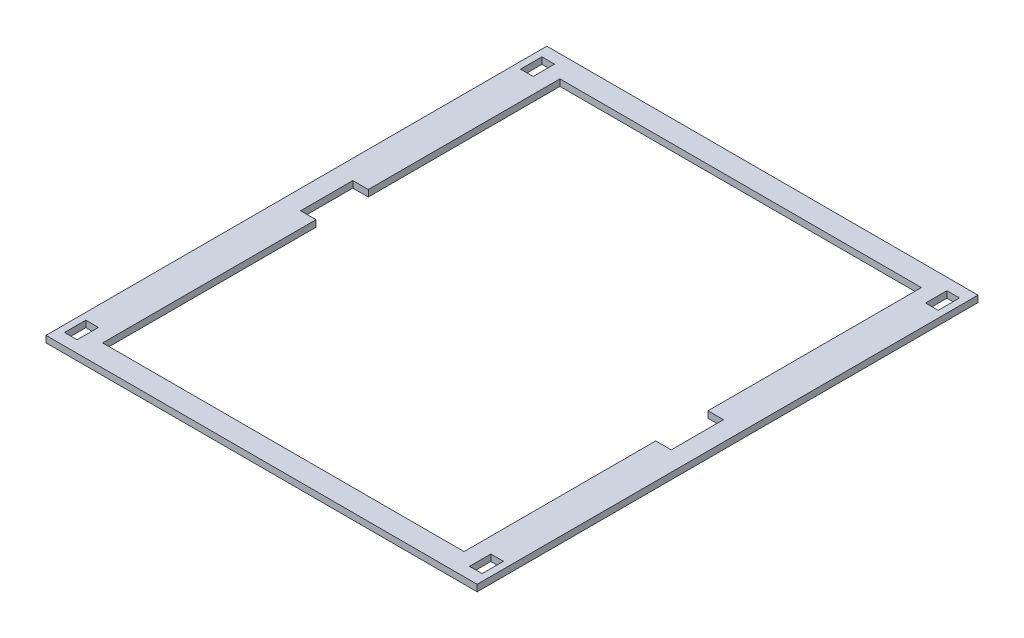
ISO-10303-21;
HEADER;
FILE_DESCRIPTION(('STEP AP214'),'2;1');
FILE_NAME('part.step','',(''),(''),'','','');
FILE_SCHEMA(('AUTOMOTIVE_DESIGN { 1 0 10303 214 1 1 1 1 }'));
ENDSEC;
DATA;
#1=APPLICATION_CONTEXT('core data for automotive mechanical design processes');
#2=APPLICATION_PROTOCOL_DEFINITION('international standard','automotive_design',2000,#1);
#3=PRODUCT_CONTEXT('',#1,'mechanical');
#4=PRODUCT('Part','Part','',(#3));
#5=PRODUCT_RELATED_PRODUCT_CATEGORY('part','',(#4));
#6=PRODUCT_DEFINITION_FORMATION('','',#4);
#7=PRODUCT_DEFINITION_CONTEXT('part definition',#1,'design');
#8=PRODUCT_DEFINITION('design','',#6,#7);
#9=PRODUCT_DEFINITION_SHAPE('','',#8);
#10=(LENGTH_UNIT() NAMED_UNIT(*) SI_UNIT(.MILLI.,.METRE.));
#11=(NAMED_UNIT(*) PLANE_ANGLE_UNIT() SI_UNIT($,.RADIAN.));
#12=(NAMED_UNIT(*) SI_UNIT($,.STERADIAN.) SOLID_ANGLE_UNIT());
#13=UNCERTAINTY_MEASURE_WITH_UNIT(LENGTH_MEASURE(1.E-05),#10,'distance_accuracy_value','');
#14=(GEOMETRIC_REPRESENTATION_CONTEXT(3) GLOBAL_UNCERTAINTY_ASSIGNED_CONTEXT((#13)) GLOBAL_UNIT_ASSIGNED_CONTEXT((#10,
#11,#12)) REPRESENTATION_CONTEXT('',''));
#15=CARTESIAN_POINT('',(0.,0.,0.));
#16=DIRECTION('',(0.,0.,1.));
#17=DIRECTION('',(1.,0.,0.));
#18=AXIS2_PLACEMENT_3D('',#15,#16,#17);
#19=CARTESIAN_POINT('',(0.,3.,0.));
#20=DIRECTION('',(0.,-1.,0.));
#21=DIRECTION('',(0.,0.,-1.));
#22=AXIS2_PLACEMENT_3D('',#19,#20,#21);
#23=PLANE('',#22);
#24=DIRECTION('',(-1.,0.,0.));
#25=VECTOR('',#24,1.);
#26=CARTESIAN_POINT('',(0.,3.,-15.1795233892321));
#27=LINE('',#26,#25);
#28=CARTESIAN_POINT('',(194.897407539515,3.,-15.1795233892321));
#29=VERTEX_POINT('',#28);
#30=CARTESIAN_POINT('',(189.097407539515,3.,-15.1795233892321));
#31=VERTEX_POINT('',#30);
#32=EDGE_CURVE('E645',#29,#31,#27,.T.);
#33=ORIENTED_EDGE('',*,*,#32,.F.);
#34=DIRECTION('',(0.,0.,-1.));
#35=VECTOR('',#34,1.);
#36=CARTESIAN_POINT('',(194.897407539515,3.,0.));
#37=LINE('',#36,#35);
#38=CARTESIAN_POINT('',(194.897407539515,3.,-5.37952338923212));
#39=VERTEX_POINT('',#38);
#40=EDGE_CURVE('E57',#39,#29,#37,.T.);
#41=ORIENTED_EDGE('',*,*,#40,.F.);
#42=DIRECTION('',(-1.,0.,0.));
#43=VECTOR('',#42,1.);
#44=CARTESIAN_POINT('',(0.,3.,-5.37952338923212));
#45=LINE('',#44,#43);
#46=CARTESIAN_POINT('',(189.097407539515,3.,-5.37952338923212));
#47=VERTEX_POINT('',#46);
#48=EDGE_CURVE('E632',#39,#47,#45,.T.);
#49=ORIENTED_EDGE('',*,*,#48,.T.);
#50=DIRECTION('',(0.,0.,-1.));
#51=VECTOR('',#50,1.);
#52=CARTESIAN_POINT('',(189.097407539515,3.,0.));
#53=LINE('',#52,#51);
#54=EDGE_CURVE('E657',#47,#31,#53,.T.);
#55=ORIENTED_EDGE('',*,*,#54,.T.);
#56=EDGE_LOOP('',(#33,#41,#49,#55));
#57=FACE_BOUND('',#56,.T.);
#58=DIRECTION('',(0.,0.,-1.));
#59=VECTOR('',#58,1.);
#60=CARTESIAN_POINT('',(3.10259246048478,3.,-5.37952338923212));
#61=LINE('',#60,#59);
#62=CARTESIAN_POINT('',(3.10259246048478,3.,-5.37952338923212));
#63=VERTEX_POINT('',#62);
#64=CARTESIAN_POINT('',(3.10259246048478,3.,-15.1795233892321));
#65=VERTEX_POINT('',#64);
#66=EDGE_CURVE('E281',#63,#65,#61,.T.);
#67=ORIENTED_EDGE('',*,*,#66,.T.);
#68=DIRECTION('',(1.,0.,0.));
#69=VECTOR('',#68,1.);
#70=CARTESIAN_POINT('',(3.10259246048478,3.,-15.1795233892321));
#71=LINE('',#70,#69);
#72=CARTESIAN_POINT('',(8.90259246048478,3.,-15.1795233892321));
#73=VERTEX_POINT('',#72);
#74=EDGE_CURVE('E277',#65,#73,#71,.T.);
#75=ORIENTED_EDGE('',*,*,#74,.T.);
#76=DIRECTION('',(0.,0.,-1.));
#77=VECTOR('',#76,1.);
#78=CARTESIAN_POINT('',(8.90259246048478,3.,-5.37952338923212));
#79=LINE('',#78,#77);
#80=CARTESIAN_POINT('',(8.90259246048478,3.,-5.37952338923212));
#81=VERTEX_POINT('',#80);
#82=EDGE_CURVE('E257',#81,#73,#79,.T.);
#83=ORIENTED_EDGE('',*,*,#82,.F.);
#84=DIRECTION('',(1.,0.,0.));
#85=VECTOR('',#84,1.);
#86=CARTESIAN_POINT('',(3.10259246048478,3.,-5.37952338923212));
#87=LINE('',#86,#85);
#88=EDGE_CURVE('E269',#63,#81,#87,.T.);
#89=ORIENTED_EDGE('',*,*,#88,.F.);
#90=EDGE_LOOP('',(#67,#75,#83,#89));
#91=FACE_BOUND('',#90,.T.);
#92=DIRECTION('',(0.,0.,1.));
#93=VECTOR('',#92,1.);
#94=CARTESIAN_POINT('',(189.097407539515,3.,0.));
#95=LINE('',#94,#93);
#96=CARTESIAN_POINT('',(189.097407539515,3.,-122.));
#97=VERTEX_POINT('',#96);
#98=CARTESIAN_POINT('',(189.097407539515,3.,-98.));
#99=VERTEX_POINT('',#98);
#100=EDGE_CURVE('E297',#97,#99,#95,.T.);
#101=ORIENTED_EDGE('',*,*,#100,.T.);
#102=DIRECTION('',(1.,0.,0.));
#103=VECTOR('',#102,1.);
#104=CARTESIAN_POINT('',(0.,3.,-98.));
#105=LINE('',#104,#103);
#106=CARTESIAN_POINT('',(182.,3.,-98.));
#107=VERTEX_POINT('',#106);
#108=EDGE_CURVE('E314',#107,#99,#105,.T.);
#109=ORIENTED_EDGE('',*,*,#108,.F.);
#110=DIRECTION('',(0.,0.,-1.));
#111=VECTOR('',#110,1.);
#112=CARTESIAN_POINT('',(182.,3.,-220.));
#113=LINE('',#112,#111);
#114=CARTESIAN_POINT('',(182.,3.,-10.));
#115=VERTEX_POINT('',#114);
#116=EDGE_CURVE('E459',#115,#107,#113,.T.);
#117=ORIENTED_EDGE('',*,*,#116,.F.);
#118=DIRECTION('',(1.,0.,0.));
#119=VECTOR('',#118,1.);
#120=CARTESIAN_POINT('',(16.,3.,-10.));
#121=LINE('',#120,#119);
#122=CARTESIAN_POINT('',(16.,3.,-10.));
#123=VERTEX_POINT('',#122);
#124=EDGE_CURVE('E421',#123,#115,#121,.T.);
#125=ORIENTED_EDGE('',*,*,#124,.F.);
#126=DIRECTION('',(0.,0.,1.));
#127=VECTOR('',#126,1.);
#128=CARTESIAN_POINT('',(16.,3.,-220.));
#129=LINE('',#128,#127);
#130=CARTESIAN_POINT('',(16.,3.,-108.));
#131=VERTEX_POINT('',#130);
#132=EDGE_CURVE('E422',#131,#123,#129,.T.);
#133=ORIENTED_EDGE('',*,*,#132,.F.);
#134=DIRECTION('',(-1.,0.,0.));
#135=VECTOR('',#134,1.);
#136=CARTESIAN_POINT('',(0.,3.,-108.));
#137=LINE('',#136,#135);
#138=CARTESIAN_POINT('',(8.90259246048478,3.,-108.));
#139=VERTEX_POINT('',#138);
#140=EDGE_CURVE('E393',#131,#139,#137,.T.);
#141=ORIENTED_EDGE('',*,*,#140,.T.);
#142=DIRECTION('',(0.,0.,1.));
#143=VECTOR('',#142,1.);
#144=CARTESIAN_POINT('',(8.90259246048478,3.,0.));
#145=LINE('',#144,#143);
#146=CARTESIAN_POINT('',(8.90259246048478,3.,-132.));
#147=VERTEX_POINT('',#146);
#148=EDGE_CURVE('E404',#147,#139,#145,.T.);
#149=ORIENTED_EDGE('',*,*,#148,.F.);
#150=DIRECTION('',(-1.,0.,0.));
#151=VECTOR('',#150,1.);
#152=CARTESIAN_POINT('',(0.,3.,-132.));
#153=LINE('',#152,#151);
#154=CARTESIAN_POINT('',(16.,3.,-132.));
#155=VERTEX_POINT('',#154);
#156=EDGE_CURVE('E399',#155,#147,#153,.T.);
#157=ORIENTED_EDGE('',*,*,#156,.F.);
#158=CARTESIAN_POINT('',(16.,3.,-220.));
#159=VERTEX_POINT('',#158);
#160=EDGE_CURVE('E415',#159,#155,#129,.T.);
#161=ORIENTED_EDGE('',*,*,#160,.F.);
#162=DIRECTION('',(-1.,0.,0.));
#163=VECTOR('',#162,1.);
#164=CARTESIAN_POINT('',(16.,3.,-220.));
#165=LINE('',#164,#163);
#166=CARTESIAN_POINT('',(182.,3.,-220.));
#167=VERTEX_POINT('',#166);
#168=EDGE_CURVE('E456',#167,#159,#165,.T.);
#169=ORIENTED_EDGE('',*,*,#168,.F.);
#170=CARTESIAN_POINT('',(182.,3.,-122.));
#171=VERTEX_POINT('',#170);
#172=EDGE_CURVE('E460',#171,#167,#113,.T.);
#173=ORIENTED_EDGE('',*,*,#172,.F.);
#174=DIRECTION('',(1.,0.,0.));
#175=VECTOR('',#174,1.);
#176=CARTESIAN_POINT('',(0.,3.,-122.));
#177=LINE('',#176,#175);
#178=EDGE_CURVE('E304',#171,#97,#177,.T.);
#179=ORIENTED_EDGE('',*,*,#178,.T.);
#180=EDGE_LOOP('',(#101,#109,#117,#125,#133,#141,#149,#157,#161,#169,#173,#179));
#181=FACE_BOUND('',#180,.T.);
#182=DIRECTION('',(0.,0.,1.));
#183=VECTOR('',#182,1.);
#184=CARTESIAN_POINT('',(0.,3.,0.));
#185=LINE('',#184,#183);
#186=CARTESIAN_POINT('',(0.,3.,-230.));
#187=VERTEX_POINT('',#186);
#188=CARTESIAN_POINT('',(0.,3.,0.));
#189=VERTEX_POINT('',#188);
#190=EDGE_CURVE('E464',#187,#189,#185,.T.);
#191=ORIENTED_EDGE('',*,*,#190,.T.);
#192=DIRECTION('',(1.,0.,0.));
#193=VECTOR('',#192,1.);
#194=CARTESIAN_POINT('',(0.,3.,0.));
#195=LINE('',#194,#193);
#196=CARTESIAN_POINT('',(198.,3.,0.));
#197=VERTEX_POINT('',#196);
#198=EDGE_CURVE('E467',#189,#197,#195,.T.);
#199=ORIENTED_EDGE('',*,*,#198,.T.);
#200=DIRECTION('',(0.,0.,-1.));
#201=VECTOR('',#200,1.);
#202=CARTESIAN_POINT('',(198.,3.,0.));
#203=LINE('',#202,#201);
#204=CARTESIAN_POINT('',(198.,3.,-230.));
#205=VERTEX_POINT('',#204);
#206=EDGE_CURVE('E471',#197,#205,#203,.T.);
#207=ORIENTED_EDGE('',*,*,#206,.T.);
#208=DIRECTION('',(-1.,0.,0.));
#209=VECTOR('',#208,1.);
#210=CARTESIAN_POINT('',(0.,3.,-230.));
#211=LINE('',#210,#209);
#212=EDGE_CURVE('E474',#205,#187,#211,.T.);
#213=ORIENTED_EDGE('',*,*,#212,.T.);
#214=EDGE_LOOP('',(#191,#199,#207,#213));
#215=FACE_BOUND('',#214,.T.);
#216=DIRECTION('',(1.,0.,0.));
#217=VECTOR('',#216,1.);
#218=CARTESIAN_POINT('',(3.10259246048478,3.,-214.820476610768));
#219=LINE('',#218,#217);
#220=CARTESIAN_POINT('',(3.10259246048478,3.,-214.820476610768));
#221=VERTEX_POINT('',#220);
#222=CARTESIAN_POINT('',(8.90259246048478,3.,-214.820476610768));
#223=VERTEX_POINT('',#222);
#224=EDGE_CURVE('E378',#221,#223,#219,.T.);
#225=ORIENTED_EDGE('',*,*,#224,.F.);
#226=DIRECTION('',(0.,0.,1.));
#227=VECTOR('',#226,1.);
#228=CARTESIAN_POINT('',(3.10259246048478,3.,-224.620476610768));
#229=LINE('',#228,#227);
#230=CARTESIAN_POINT('',(3.10259246048478,3.,-224.620476610768));
#231=VERTEX_POINT('',#230);
#232=EDGE_CURVE('E324',#231,#221,#229,.T.);
#233=ORIENTED_EDGE('',*,*,#232,.F.);
#234=DIRECTION('',(1.,0.,0.));
#235=VECTOR('',#234,1.);
#236=CARTESIAN_POINT('',(3.10259246048478,3.,-224.620476610768));
#237=LINE('',#236,#235);
#238=CARTESIAN_POINT('',(8.90259246048478,3.,-224.620476610768));
#239=VERTEX_POINT('',#238);
#240=EDGE_CURVE('E363',#231,#239,#237,.T.);
#241=ORIENTED_EDGE('',*,*,#240,.T.);
#242=DIRECTION('',(0.,0.,1.));
#243=VECTOR('',#242,1.);
#244=CARTESIAN_POINT('',(8.90259246048478,3.,-224.620476610768));
#245=LINE('',#244,#243);
#246=EDGE_CURVE('E367',#239,#223,#245,.T.);
#247=ORIENTED_EDGE('',*,*,#246,.T.);
#248=EDGE_LOOP('',(#225,#233,#241,#247));
#249=FACE_BOUND('',#248,.T.);
#250=DIRECTION('',(0.,0.,1.));
#251=VECTOR('',#250,1.);
#252=CARTESIAN_POINT('',(194.897407539515,3.,0.));
#253=LINE('',#252,#251);
#254=CARTESIAN_POINT('',(194.897407539515,3.,-224.620476610768));
#255=VERTEX_POINT('',#254);
#256=CARTESIAN_POINT('',(194.897407539515,3.,-214.820476610768));
#257=VERTEX_POINT('',#256);
#258=EDGE_CURVE('E65',#255,#257,#253,.T.);
#259=ORIENTED_EDGE('',*,*,#258,.T.);
#260=DIRECTION('',(-1.,0.,0.));
#261=VECTOR('',#260,1.);
#262=CARTESIAN_POINT('',(0.,3.,-214.820476610768));
#263=LINE('',#262,#261);
#264=CARTESIAN_POINT('',(189.097407539515,3.,-214.820476610768));
#265=VERTEX_POINT('',#264);
#266=EDGE_CURVE('E325',#257,#265,#263,.T.);
#267=ORIENTED_EDGE('',*,*,#266,.T.);
#268=DIRECTION('',(0.,0.,1.));
#269=VECTOR('',#268,1.);
#270=CARTESIAN_POINT('',(189.097407539515,3.,0.));
#271=LINE('',#270,#269);
#272=CARTESIAN_POINT('',(189.097407539515,3.,-224.620476610768));
#273=VERTEX_POINT('',#272);
#274=EDGE_CURVE('E330',#273,#265,#271,.T.);
#275=ORIENTED_EDGE('',*,*,#274,.F.);
#276=DIRECTION('',(-1.,0.,0.));
#277=VECTOR('',#276,1.);
#278=CARTESIAN_POINT('',(0.,3.,-224.620476610768));
#279=LINE('',#278,#277);
#280=EDGE_CURVE('E343',#255,#273,#279,.T.);
#281=ORIENTED_EDGE('',*,*,#280,.F.);
#282=EDGE_LOOP('',(#259,#267,#275,#281));
#283=FACE_BOUND('',#282,.T.);
#284=ADVANCED_FACE('F42',(#57,#91,#181,#215,#249,#283),#23,.F.);
#285=CARTESIAN_POINT('',(0.,0.,0.));
#286=DIRECTION('',(0.,-1.,0.));
#287=DIRECTION('',(0.,0.,-1.));
#288=AXIS2_PLACEMENT_3D('',#285,#286,#287);
#289=PLANE('',#288);
#290=DIRECTION('',(0.,0.,-1.));
#291=VECTOR('',#290,1.);
#292=CARTESIAN_POINT('',(194.897407539515,0.,0.));
#293=LINE('',#292,#291);
#294=CARTESIAN_POINT('',(194.897407539515,0.,-5.37952338923212));
#295=VERTEX_POINT('',#294);
#296=CARTESIAN_POINT('',(194.897407539515,0.,-15.1795233892321));
#297=VERTEX_POINT('',#296);
#298=EDGE_CURVE('E629',#295,#297,#293,.T.);
#299=ORIENTED_EDGE('',*,*,#298,.T.);
#300=DIRECTION('',(-1.,0.,0.));
#301=VECTOR('',#300,1.);
#302=CARTESIAN_POINT('',(0.,0.,-15.1795233892321));
#303=LINE('',#302,#301);
#304=CARTESIAN_POINT('',(189.097407539515,0.,-15.1795233892321));
#305=VERTEX_POINT('',#304);
#306=EDGE_CURVE('E633',#297,#305,#303,.T.);
#307=ORIENTED_EDGE('',*,*,#306,.T.);
#308=DIRECTION('',(0.,0.,-1.));
#309=VECTOR('',#308,1.);
#310=CARTESIAN_POINT('',(189.097407539515,0.,0.));
#311=LINE('',#310,#309);
#312=CARTESIAN_POINT('',(189.097407539515,0.,-5.37952338923212));
#313=VERTEX_POINT('',#312);
#314=EDGE_CURVE('E636',#313,#305,#311,.T.);
#315=ORIENTED_EDGE('',*,*,#314,.F.);
#316=DIRECTION('',(-1.,0.,0.));
#317=VECTOR('',#316,1.);
#318=CARTESIAN_POINT('',(0.,0.,-5.37952338923212));
#319=LINE('',#318,#317);
#320=EDGE_CURVE('E639',#295,#313,#319,.T.);
#321=ORIENTED_EDGE('',*,*,#320,.F.);
#322=EDGE_LOOP('',(#299,#307,#315,#321));
#323=FACE_BOUND('',#322,.T.);
#324=DIRECTION('',(1.,0.,0.));
#325=VECTOR('',#324,1.);
#326=CARTESIAN_POINT('',(0.,0.,-98.));
#327=LINE('',#326,#325);
#328=CARTESIAN_POINT('',(182.,0.,-98.));
#329=VERTEX_POINT('',#328);
#330=CARTESIAN_POINT('',(189.097407539515,0.,-98.));
#331=VERTEX_POINT('',#330);
#332=EDGE_CURVE('E306',#329,#331,#327,.T.);
#333=ORIENTED_EDGE('',*,*,#332,.T.);
#334=DIRECTION('',(0.,0.,1.));
#335=VECTOR('',#334,1.);
#336=CARTESIAN_POINT('',(189.097407539515,0.,0.));
#337=LINE('',#336,#335);
#338=CARTESIAN_POINT('',(189.097407539515,0.,-122.));
#339=VERTEX_POINT('',#338);
#340=EDGE_CURVE('E312',#339,#331,#337,.T.);
#341=ORIENTED_EDGE('',*,*,#340,.F.);
#342=DIRECTION('',(1.,0.,0.));
#343=VECTOR('',#342,1.);
#344=CARTESIAN_POINT('',(0.,0.,-122.));
#345=LINE('',#344,#343);
#346=CARTESIAN_POINT('',(182.,0.,-122.));
#347=VERTEX_POINT('',#346);
#348=EDGE_CURVE('E309',#347,#339,#345,.T.);
#349=ORIENTED_EDGE('',*,*,#348,.F.);
#350=DIRECTION('',(0.,0.,-1.));
#351=VECTOR('',#350,1.);
#352=CARTESIAN_POINT('',(182.,0.,-220.));
#353=LINE('',#352,#351);
#354=CARTESIAN_POINT('',(182.,0.,-220.));
#355=VERTEX_POINT('',#354);
#356=EDGE_CURVE('E595',#347,#355,#353,.T.);
#357=ORIENTED_EDGE('',*,*,#356,.T.);
#358=DIRECTION('',(-1.,0.,0.));
#359=VECTOR('',#358,1.);
#360=CARTESIAN_POINT('',(16.,0.,-220.));
#361=LINE('',#360,#359);
#362=CARTESIAN_POINT('',(16.,0.,-220.));
#363=VERTEX_POINT('',#362);
#364=EDGE_CURVE('E589',#355,#363,#361,.T.);
#365=ORIENTED_EDGE('',*,*,#364,.T.);
#366=DIRECTION('',(0.,0.,1.));
#367=VECTOR('',#366,1.);
#368=CARTESIAN_POINT('',(16.,0.,-220.));
#369=LINE('',#368,#367);
#370=CARTESIAN_POINT('',(16.,0.,-132.));
#371=VERTEX_POINT('',#370);
#372=EDGE_CURVE('E599',#363,#371,#369,.T.);
#373=ORIENTED_EDGE('',*,*,#372,.T.);
#374=DIRECTION('',(-1.,0.,0.));
#375=VECTOR('',#374,1.);
#376=CARTESIAN_POINT('',(0.,0.,-132.));
#377=LINE('',#376,#375);
#378=CARTESIAN_POINT('',(8.90259246048478,0.,-132.));
#379=VERTEX_POINT('',#378);
#380=EDGE_CURVE('E389',#371,#379,#377,.T.);
#381=ORIENTED_EDGE('',*,*,#380,.T.);
#382=DIRECTION('',(0.,0.,1.));
#383=VECTOR('',#382,1.);
#384=CARTESIAN_POINT('',(8.90259246048478,0.,0.));
#385=LINE('',#384,#383);
#386=CARTESIAN_POINT('',(8.90259246048478,0.,-108.));
#387=VERTEX_POINT('',#386);
#388=EDGE_CURVE('E392',#379,#387,#385,.T.);
#389=ORIENTED_EDGE('',*,*,#388,.T.);
#390=DIRECTION('',(-1.,0.,0.));
#391=VECTOR('',#390,1.);
#392=CARTESIAN_POINT('',(0.,0.,-108.));
#393=LINE('',#392,#391);
#394=CARTESIAN_POINT('',(16.,0.,-108.));
#395=VERTEX_POINT('',#394);
#396=EDGE_CURVE('E396',#395,#387,#393,.T.);
#397=ORIENTED_EDGE('',*,*,#396,.F.);
#398=CARTESIAN_POINT('',(16.,0.,-10.));
#399=VERTEX_POINT('',#398);
#400=EDGE_CURVE('E435',#395,#399,#369,.T.);
#401=ORIENTED_EDGE('',*,*,#400,.T.);
#402=DIRECTION('',(1.,0.,0.));
#403=VECTOR('',#402,1.);
#404=CARTESIAN_POINT('',(16.,0.,-10.));
#405=LINE('',#404,#403);
#406=CARTESIAN_POINT('',(182.,0.,-10.));
#407=VERTEX_POINT('',#406);
#408=EDGE_CURVE('E596',#399,#407,#405,.T.);
#409=ORIENTED_EDGE('',*,*,#408,.T.);
#410=EDGE_CURVE('E592',#407,#329,#353,.T.);
#411=ORIENTED_EDGE('',*,*,#410,.T.);
#412=EDGE_LOOP('',(#333,#341,#349,#357,#365,#373,#381,#389,#397,#401,#409,#411));
#413=FACE_BOUND('',#412,.T.);
#414=DIRECTION('',(0.,0.,1.));
#415=VECTOR('',#414,1.);
#416=CARTESIAN_POINT('',(3.10259246048478,0.,-224.620476610768));
#417=LINE('',#416,#415);
#418=CARTESIAN_POINT('',(3.10259246048478,0.,-224.620476610768));
#419=VERTEX_POINT('',#418);
#420=CARTESIAN_POINT('',(3.10259246048478,0.,-214.820476610768));
#421=VERTEX_POINT('',#420);
#422=EDGE_CURVE('E368',#419,#421,#417,.T.);
#423=ORIENTED_EDGE('',*,*,#422,.T.);
#424=DIRECTION('',(1.,0.,0.));
#425=VECTOR('',#424,1.);
#426=CARTESIAN_POINT('',(3.10259246048478,0.,-214.820476610768));
#427=LINE('',#426,#425);
#428=CARTESIAN_POINT('',(8.90259246048478,0.,-214.820476610768));
#429=VERTEX_POINT('',#428);
#430=EDGE_CURVE('E384',#421,#429,#427,.T.);
#431=ORIENTED_EDGE('',*,*,#430,.T.);
#432=DIRECTION('',(0.,0.,1.));
#433=VECTOR('',#432,1.);
#434=CARTESIAN_POINT('',(8.90259246048478,0.,-224.620476610768));
#435=LINE('',#434,#433);
#436=CARTESIAN_POINT('',(8.90259246048478,0.,-224.620476610768));
#437=VERTEX_POINT('',#436);
#438=EDGE_CURVE('E381',#437,#429,#435,.T.);
#439=ORIENTED_EDGE('',*,*,#438,.F.);
#440=DIRECTION('',(1.,0.,0.));
#441=VECTOR('',#440,1.);
#442=CARTESIAN_POINT('',(3.10259246048478,0.,-224.620476610768));
#443=LINE('',#442,#441);
#444=EDGE_CURVE('E356',#419,#437,#443,.T.);
#445=ORIENTED_EDGE('',*,*,#444,.F.);
#446=EDGE_LOOP('',(#423,#431,#439,#445));
#447=FACE_BOUND('',#446,.T.);
#448=DIRECTION('',(0.,0.,1.));
#449=VECTOR('',#448,1.);
#450=CARTESIAN_POINT('',(0.,0.,0.));
#451=LINE('',#450,#449);
#452=CARTESIAN_POINT('',(0.,0.,-230.));
#453=VERTEX_POINT('',#452);
#454=CARTESIAN_POINT('',(0.,0.,0.));
#455=VERTEX_POINT('',#454);
#456=EDGE_CURVE('E553',#453,#455,#451,.T.);
#457=ORIENTED_EDGE('',*,*,#456,.F.);
#458=DIRECTION('',(-1.,0.,0.));
#459=VECTOR('',#458,1.);
#460=CARTESIAN_POINT('',(0.,0.,-230.));
#461=LINE('',#460,#459);
#462=CARTESIAN_POINT('',(198.,0.,-230.));
#463=VERTEX_POINT('',#462);
#464=EDGE_CURVE('E468',#463,#453,#461,.T.);
#465=ORIENTED_EDGE('',*,*,#464,.F.);
#466=DIRECTION('',(0.,0.,-1.));
#467=VECTOR('',#466,1.);
#468=CARTESIAN_POINT('',(198.,0.,0.));
#469=LINE('',#468,#467);
#470=CARTESIAN_POINT('',(198.,0.,0.));
#471=VERTEX_POINT('',#470);
#472=EDGE_CURVE('E552',#471,#463,#469,.T.);
#473=ORIENTED_EDGE('',*,*,#472,.F.);
#474=DIRECTION('',(1.,0.,0.));
#475=VECTOR('',#474,1.);
#476=CARTESIAN_POINT('',(0.,0.,0.));
#477=LINE('',#476,#475);
#478=EDGE_CURVE('E544',#455,#471,#477,.T.);
#479=ORIENTED_EDGE('',*,*,#478,.F.);
#480=EDGE_LOOP('',(#457,#465,#473,#479));
#481=FACE_BOUND('',#480,.T.);
#482=DIRECTION('',(1.,0.,0.));
#483=VECTOR('',#482,1.);
#484=CARTESIAN_POINT('',(3.10259246048478,0.,-15.1795233892321));
#485=LINE('',#484,#483);
#486=CARTESIAN_POINT('',(3.10259246048478,0.,-15.1795233892321));
#487=VERTEX_POINT('',#486);
#488=CARTESIAN_POINT('',(8.90259246048478,0.,-15.1795233892321));
#489=VERTEX_POINT('',#488);
#490=EDGE_CURVE('E684',#487,#489,#485,.T.);
#491=ORIENTED_EDGE('',*,*,#490,.F.);
#492=DIRECTION('',(0.,0.,-1.));
#493=VECTOR('',#492,1.);
#494=CARTESIAN_POINT('',(3.10259246048478,0.,-5.37952338923212));
#495=LINE('',#494,#493);
#496=CARTESIAN_POINT('',(3.10259246048478,0.,-5.37952338923212));
#497=VERTEX_POINT('',#496);
#498=EDGE_CURVE('E274',#497,#487,#495,.T.);
#499=ORIENTED_EDGE('',*,*,#498,.F.);
#500=DIRECTION('',(1.,0.,0.));
#501=VECTOR('',#500,1.);
#502=CARTESIAN_POINT('',(3.10259246048478,0.,-5.37952338923212));
#503=LINE('',#502,#501);
#504=CARTESIAN_POINT('',(8.90259246048478,0.,-5.37952338923212));
#505=VERTEX_POINT('',#504);
#506=EDGE_CURVE('E687',#497,#505,#503,.T.);
#507=ORIENTED_EDGE('',*,*,#506,.T.);
#508=DIRECTION('',(0.,0.,-1.));
#509=VECTOR('',#508,1.);
#510=CARTESIAN_POINT('',(8.90259246048478,0.,-5.37952338923212));
#511=LINE('',#510,#509);
#512=EDGE_CURVE('E260',#505,#489,#511,.T.);
#513=ORIENTED_EDGE('',*,*,#512,.T.);
#514=EDGE_LOOP('',(#491,#499,#507,#513));
#515=FACE_BOUND('',#514,.T.);
#516=DIRECTION('',(-1.,0.,0.));
#517=VECTOR('',#516,1.);
#518=CARTESIAN_POINT('',(0.,0.,-214.820476610768));
#519=LINE('',#518,#517);
#520=CARTESIAN_POINT('',(194.897407539515,0.,-214.820476610768));
#521=VERTEX_POINT('',#520);
#522=CARTESIAN_POINT('',(189.097407539515,0.,-214.820476610768));
#523=VERTEX_POINT('',#522);
#524=EDGE_CURVE('E317',#521,#523,#519,.T.);
#525=ORIENTED_EDGE('',*,*,#524,.F.);
#526=DIRECTION('',(0.,0.,1.));
#527=VECTOR('',#526,1.);
#528=CARTESIAN_POINT('',(194.897407539515,0.,0.));
#529=LINE('',#528,#527);
#530=CARTESIAN_POINT('',(194.897407539515,0.,-224.620476610768));
#531=VERTEX_POINT('',#530);
#532=EDGE_CURVE('E331',#531,#521,#529,.T.);
#533=ORIENTED_EDGE('',*,*,#532,.F.);
#534=DIRECTION('',(-1.,0.,0.));
#535=VECTOR('',#534,1.);
#536=CARTESIAN_POINT('',(0.,0.,-224.620476610768));
#537=LINE('',#536,#535);
#538=CARTESIAN_POINT('',(189.097407539515,0.,-224.620476610768));
#539=VERTEX_POINT('',#538);
#540=EDGE_CURVE('E349',#531,#539,#537,.T.);
#541=ORIENTED_EDGE('',*,*,#540,.T.);
#542=DIRECTION('',(0.,0.,1.));
#543=VECTOR('',#542,1.);
#544=CARTESIAN_POINT('',(189.097407539515,0.,0.));
#545=LINE('',#544,#543);
#546=EDGE_CURVE('E346',#539,#523,#545,.T.);
#547=ORIENTED_EDGE('',*,*,#546,.T.);
#548=EDGE_LOOP('',(#525,#533,#541,#547));
#549=FACE_BOUND('',#548,.T.);
#550=ADVANCED_FACE('F498',(#323,#413,#447,#481,#515,#549),#289,.T.);
#551=CARTESIAN_POINT('',(16.,3.,-220.));
#552=DIRECTION('',(1.,0.,0.));
#553=DIRECTION('',(0.,0.,-1.));
#554=AXIS2_PLACEMENT_3D('',#551,#552,#553);
#555=PLANE('',#554);
#556=ORIENTED_EDGE('',*,*,#400,.F.);
#557=DIRECTION('',(0.,1.,0.));
#558=VECTOR('',#557,1.);
#559=CARTESIAN_POINT('',(16.,0.,-108.));
#560=LINE('',#559,#558);
#561=EDGE_CURVE('E436',#395,#131,#560,.T.);
#562=ORIENTED_EDGE('',*,*,#561,.T.);
#563=ORIENTED_EDGE('',*,*,#132,.T.);
#564=DIRECTION('',(0.,-1.,0.));
#565=VECTOR('',#564,1.);
#566=CARTESIAN_POINT('',(16.,3.,-10.));
#567=LINE('',#566,#565);
#568=EDGE_CURVE('E570',#123,#399,#567,.T.);
#569=ORIENTED_EDGE('',*,*,#568,.T.);
#570=EDGE_LOOP('',(#556,#562,#563,#569));
#571=FACE_BOUND('',#570,.T.);
#572=ADVANCED_FACE('F520',(#571),#555,.T.);
#573=CARTESIAN_POINT('',(182.,3.,-220.));
#574=DIRECTION('',(-1.,0.,0.));
#575=DIRECTION('',(0.,0.,1.));
#576=AXIS2_PLACEMENT_3D('',#573,#574,#575);
#577=PLANE('',#576);
#578=ORIENTED_EDGE('',*,*,#356,.F.);
#579=DIRECTION('',(0.,1.,0.));
#580=VECTOR('',#579,1.);
#581=CARTESIAN_POINT('',(182.,0.,-122.));
#582=LINE('',#581,#580);
#583=EDGE_CURVE('E625',#347,#171,#582,.T.);
#584=ORIENTED_EDGE('',*,*,#583,.T.);
#585=ORIENTED_EDGE('',*,*,#172,.T.);
#586=DIRECTION('',(0.,-1.,0.));
#587=VECTOR('',#586,1.);
#588=CARTESIAN_POINT('',(182.,3.,-220.));
#589=LINE('',#588,#587);
#590=EDGE_CURVE('E584',#167,#355,#589,.T.);
#591=ORIENTED_EDGE('',*,*,#590,.T.);
#592=EDGE_LOOP('',(#578,#584,#585,#591));
#593=FACE_BOUND('',#592,.T.);
#594=ADVANCED_FACE('F541',(#593),#577,.T.);
#595=CARTESIAN_POINT('',(0.,3.,0.));
#596=DIRECTION('',(1.,0.,0.));
#597=DIRECTION('',(0.,0.,-1.));
#598=AXIS2_PLACEMENT_3D('',#595,#596,#597);
#599=PLANE('',#598);
#600=ORIENTED_EDGE('',*,*,#456,.T.);
#601=DIRECTION('',(0.,-1.,0.));
#602=VECTOR('',#601,1.);
#603=CARTESIAN_POINT('',(0.,3.,0.));
#604=LINE('',#603,#602);
#605=EDGE_CURVE('E12',#189,#455,#604,.T.);
#606=ORIENTED_EDGE('',*,*,#605,.F.);
#607=ORIENTED_EDGE('',*,*,#190,.F.);
#608=DIRECTION('',(0.,-1.,0.));
#609=VECTOR('',#608,1.);
#610=CARTESIAN_POINT('',(0.,3.,-230.));
#611=LINE('',#610,#609);
#612=EDGE_CURVE('E477',#187,#453,#611,.T.);
#613=ORIENTED_EDGE('',*,*,#612,.T.);
#614=EDGE_LOOP('',(#600,#606,#607,#613));
#615=FACE_BOUND('',#614,.T.);
#616=ADVANCED_FACE('F44',(#615),#599,.F.);
#617=CARTESIAN_POINT('',(0.,3.,0.));
#618=DIRECTION('',(0.,0.,-1.));
#619=DIRECTION('',(-1.,0.,0.));
#620=AXIS2_PLACEMENT_3D('',#617,#618,#619);
#621=PLANE('',#620);
#622=ORIENTED_EDGE('',*,*,#478,.T.);
#623=DIRECTION('',(0.,-1.,0.));
#624=VECTOR('',#623,1.);
#625=CARTESIAN_POINT('',(198.,3.,0.));
#626=LINE('',#625,#624);
#627=EDGE_CURVE('E50',#197,#471,#626,.T.);
#628=ORIENTED_EDGE('',*,*,#627,.F.);
#629=ORIENTED_EDGE('',*,*,#198,.F.);
#630=ORIENTED_EDGE('',*,*,#605,.T.);
#631=EDGE_LOOP('',(#622,#628,#629,#630));
#632=FACE_BOUND('',#631,.T.);
#633=ADVANCED_FACE('F534',(#632),#621,.F.);
#634=CARTESIAN_POINT('',(198.,3.,0.));
#635=DIRECTION('',(-1.,0.,0.));
#636=DIRECTION('',(0.,0.,1.));
#637=AXIS2_PLACEMENT_3D('',#634,#635,#636);
#638=PLANE('',#637);
#639=ORIENTED_EDGE('',*,*,#472,.T.);
#640=DIRECTION('',(0.,-1.,0.));
#641=VECTOR('',#640,1.);
#642=CARTESIAN_POINT('',(198.,3.,-230.));
#643=LINE('',#642,#641);
#644=EDGE_CURVE('E557',#205,#463,#643,.T.);
#645=ORIENTED_EDGE('',*,*,#644,.F.);
#646=ORIENTED_EDGE('',*,*,#206,.F.);
#647=ORIENTED_EDGE('',*,*,#627,.T.);
#648=EDGE_LOOP('',(#639,#645,#646,#647));
#649=FACE_BOUND('',#648,.T.);
#650=ADVANCED_FACE('F531',(#649),#638,.F.);
#651=CARTESIAN_POINT('',(0.,3.,-230.));
#652=DIRECTION('',(0.,0.,1.));
#653=DIRECTION('',(1.,0.,0.));
#654=AXIS2_PLACEMENT_3D('',#651,#652,#653);
#655=PLANE('',#654);
#656=ORIENTED_EDGE('',*,*,#464,.T.);
#657=ORIENTED_EDGE('',*,*,#612,.F.);
#658=ORIENTED_EDGE('',*,*,#212,.F.);
#659=ORIENTED_EDGE('',*,*,#644,.T.);
#660=EDGE_LOOP('',(#656,#657,#658,#659));
#661=FACE_BOUND('',#660,.T.);
#662=ADVANCED_FACE('F528',(#661),#655,.F.);
#663=DIRECTION('',(0.,1.,0.));
#664=VECTOR('',#663,1.);
#665=CARTESIAN_POINT('',(16.,0.,-132.));
#666=LINE('',#665,#664);
#667=EDGE_CURVE('E433',#371,#155,#666,.T.);
#668=ORIENTED_EDGE('',*,*,#667,.F.);
#669=ORIENTED_EDGE('',*,*,#372,.F.);
#670=DIRECTION('',(0.,-1.,0.));
#671=VECTOR('',#670,1.);
#672=CARTESIAN_POINT('',(16.,3.,-220.));
#673=LINE('',#672,#671);
#674=EDGE_CURVE('E458',#159,#363,#673,.T.);
#675=ORIENTED_EDGE('',*,*,#674,.F.);
#676=ORIENTED_EDGE('',*,*,#160,.T.);
#677=EDGE_LOOP('',(#668,#669,#675,#676));
#678=FACE_BOUND('',#677,.T.);
#679=ADVANCED_FACE('F525',(#678),#555,.T.);
#680=CARTESIAN_POINT('',(16.,3.,-10.));
#681=DIRECTION('',(0.,0.,-1.));
#682=DIRECTION('',(-1.,0.,0.));
#683=AXIS2_PLACEMENT_3D('',#680,#681,#682);
#684=PLANE('',#683);
#685=ORIENTED_EDGE('',*,*,#408,.F.);
#686=ORIENTED_EDGE('',*,*,#568,.F.);
#687=ORIENTED_EDGE('',*,*,#124,.T.);
#688=DIRECTION('',(0.,-1.,0.));
#689=VECTOR('',#688,1.);
#690=CARTESIAN_POINT('',(182.,3.,-10.));
#691=LINE('',#690,#689);
#692=EDGE_CURVE('E572',#115,#407,#691,.T.);
#693=ORIENTED_EDGE('',*,*,#692,.T.);
#694=EDGE_LOOP('',(#685,#686,#687,#693));
#695=FACE_BOUND('',#694,.T.);
#696=ADVANCED_FACE('F960',(#695),#684,.T.);
#697=DIRECTION('',(0.,1.,0.));
#698=VECTOR('',#697,1.);
#699=CARTESIAN_POINT('',(182.,0.,-98.));
#700=LINE('',#699,#698);
#701=EDGE_CURVE('E614',#329,#107,#700,.T.);
#702=ORIENTED_EDGE('',*,*,#701,.F.);
#703=ORIENTED_EDGE('',*,*,#410,.F.);
#704=ORIENTED_EDGE('',*,*,#692,.F.);
#705=ORIENTED_EDGE('',*,*,#116,.T.);
#706=EDGE_LOOP('',(#702,#703,#704,#705));
#707=FACE_BOUND('',#706,.T.);
#708=ADVANCED_FACE('F612',(#707),#577,.T.);
#709=CARTESIAN_POINT('',(16.,3.,-220.));
#710=DIRECTION('',(0.,0.,1.));
#711=DIRECTION('',(1.,0.,0.));
#712=AXIS2_PLACEMENT_3D('',#709,#710,#711);
#713=PLANE('',#712);
#714=ORIENTED_EDGE('',*,*,#364,.F.);
#715=ORIENTED_EDGE('',*,*,#590,.F.);
#716=ORIENTED_EDGE('',*,*,#168,.T.);
#717=ORIENTED_EDGE('',*,*,#674,.T.);
#718=EDGE_LOOP('',(#714,#715,#716,#717));
#719=FACE_BOUND('',#718,.T.);
#720=ADVANCED_FACE('F725',(#719),#713,.T.);
#721=CARTESIAN_POINT('',(189.097407539515,0.,0.));
#722=DIRECTION('',(-1.,0.,0.));
#723=DIRECTION('',(0.,0.,1.));
#724=AXIS2_PLACEMENT_3D('',#721,#722,#723);
#725=PLANE('',#724);
#726=ORIENTED_EDGE('',*,*,#100,.F.);
#727=DIRECTION('',(0.,1.,0.));
#728=VECTOR('',#727,1.);
#729=CARTESIAN_POINT('',(189.097407539515,0.,-122.));
#730=LINE('',#729,#728);
#731=EDGE_CURVE('E310',#339,#97,#730,.T.);
#732=ORIENTED_EDGE('',*,*,#731,.F.);
#733=ORIENTED_EDGE('',*,*,#340,.T.);
#734=DIRECTION('',(0.,1.,0.));
#735=VECTOR('',#734,1.);
#736=CARTESIAN_POINT('',(189.097407539515,0.,-98.));
#737=LINE('',#736,#735);
#738=EDGE_CURVE('E342',#331,#99,#737,.T.);
#739=ORIENTED_EDGE('',*,*,#738,.T.);
#740=EDGE_LOOP('',(#726,#732,#733,#739));
#741=FACE_BOUND('',#740,.T.);
#742=ADVANCED_FACE('F721',(#741),#725,.T.);
#743=CARTESIAN_POINT('',(0.,0.,-98.));
#744=DIRECTION('',(0.,0.,1.));
#745=DIRECTION('',(1.,0.,0.));
#746=AXIS2_PLACEMENT_3D('',#743,#744,#745);
#747=PLANE('',#746);
#748=ORIENTED_EDGE('',*,*,#108,.T.);
#749=ORIENTED_EDGE('',*,*,#738,.F.);
#750=ORIENTED_EDGE('',*,*,#332,.F.);
#751=ORIENTED_EDGE('',*,*,#701,.T.);
#752=EDGE_LOOP('',(#748,#749,#750,#751));
#753=FACE_BOUND('',#752,.T.);
#754=ADVANCED_FACE('F724',(#753),#747,.F.);
#755=CARTESIAN_POINT('',(0.,0.,-122.));
#756=DIRECTION('',(0.,0.,1.));
#757=DIRECTION('',(1.,0.,0.));
#758=AXIS2_PLACEMENT_3D('',#755,#756,#757);
#759=PLANE('',#758);
#760=ORIENTED_EDGE('',*,*,#178,.F.);
#761=ORIENTED_EDGE('',*,*,#583,.F.);
#762=ORIENTED_EDGE('',*,*,#348,.T.);
#763=ORIENTED_EDGE('',*,*,#731,.T.);
#764=EDGE_LOOP('',(#760,#761,#762,#763));
#765=FACE_BOUND('',#764,.T.);
#766=ADVANCED_FACE('F727',(#765),#759,.T.);
#767=CARTESIAN_POINT('',(0.,0.,-132.));
#768=DIRECTION('',(0.,0.,-1.));
#769=DIRECTION('',(-1.,0.,0.));
#770=AXIS2_PLACEMENT_3D('',#767,#768,#769);
#771=PLANE('',#770);
#772=ORIENTED_EDGE('',*,*,#156,.T.);
#773=DIRECTION('',(0.,1.,0.));
#774=VECTOR('',#773,1.);
#775=CARTESIAN_POINT('',(8.90259246048478,0.,-132.));
#776=LINE('',#775,#774);
#777=EDGE_CURVE('E398',#379,#147,#776,.T.);
#778=ORIENTED_EDGE('',*,*,#777,.F.);
#779=ORIENTED_EDGE('',*,*,#380,.F.);
#780=ORIENTED_EDGE('',*,*,#667,.T.);
#781=EDGE_LOOP('',(#772,#778,#779,#780));
#782=FACE_BOUND('',#781,.T.);
#783=ADVANCED_FACE('F448',(#782),#771,.F.);
#784=CARTESIAN_POINT('',(0.,0.,-108.));
#785=DIRECTION('',(0.,0.,-1.));
#786=DIRECTION('',(-1.,0.,0.));
#787=AXIS2_PLACEMENT_3D('',#784,#785,#786);
#788=PLANE('',#787);
#789=ORIENTED_EDGE('',*,*,#140,.F.);
#790=ORIENTED_EDGE('',*,*,#561,.F.);
#791=ORIENTED_EDGE('',*,*,#396,.T.);
#792=DIRECTION('',(0.,1.,0.));
#793=VECTOR('',#792,1.);
#794=CARTESIAN_POINT('',(8.90259246048478,0.,-108.));
#795=LINE('',#794,#793);
#796=EDGE_CURVE('E438',#387,#139,#795,.T.);
#797=ORIENTED_EDGE('',*,*,#796,.T.);
#798=EDGE_LOOP('',(#789,#790,#791,#797));
#799=FACE_BOUND('',#798,.T.);
#800=ADVANCED_FACE('F870',(#799),#788,.T.);
#801=CARTESIAN_POINT('',(8.90259246048478,0.,0.));
#802=DIRECTION('',(-1.,0.,0.));
#803=DIRECTION('',(0.,0.,1.));
#804=AXIS2_PLACEMENT_3D('',#801,#802,#803);
#805=PLANE('',#804);
#806=ORIENTED_EDGE('',*,*,#148,.T.);
#807=ORIENTED_EDGE('',*,*,#796,.F.);
#808=ORIENTED_EDGE('',*,*,#388,.F.);
#809=ORIENTED_EDGE('',*,*,#777,.T.);
#810=EDGE_LOOP('',(#806,#807,#808,#809));
#811=FACE_BOUND('',#810,.T.);
#812=ADVANCED_FACE('F444',(#811),#805,.F.);
#813=CARTESIAN_POINT('',(3.10259246048478,0.,-5.37952338923212));
#814=DIRECTION('',(1.,0.,0.));
#815=DIRECTION('',(0.,0.,-1.));
#816=AXIS2_PLACEMENT_3D('',#813,#814,#815);
#817=PLANE('',#816);
#818=ORIENTED_EDGE('',*,*,#66,.F.);
#819=DIRECTION('',(0.,1.,0.));
#820=VECTOR('',#819,1.);
#821=CARTESIAN_POINT('',(3.10259246048478,0.,-5.37952338923212));
#822=LINE('',#821,#820);
#823=EDGE_CURVE('E264',#497,#63,#822,.T.);
#824=ORIENTED_EDGE('',*,*,#823,.F.);
#825=ORIENTED_EDGE('',*,*,#498,.T.);
#826=DIRECTION('',(0.,1.,0.));
#827=VECTOR('',#826,1.);
#828=CARTESIAN_POINT('',(3.10259246048478,0.,-15.1795233892321));
#829=LINE('',#828,#827);
#830=EDGE_CURVE('E693',#487,#65,#829,.T.);
#831=ORIENTED_EDGE('',*,*,#830,.T.);
#832=EDGE_LOOP('',(#818,#824,#825,#831));
#833=FACE_BOUND('',#832,.T.);
#834=ADVANCED_FACE('F691',(#833),#817,.T.);
#835=CARTESIAN_POINT('',(3.10259246048478,0.,-15.1795233892321));
#836=DIRECTION('',(0.,0.,1.));
#837=DIRECTION('',(1.,0.,0.));
#838=AXIS2_PLACEMENT_3D('',#835,#836,#837);
#839=PLANE('',#838);
#840=ORIENTED_EDGE('',*,*,#74,.F.);
#841=ORIENTED_EDGE('',*,*,#830,.F.);
#842=ORIENTED_EDGE('',*,*,#490,.T.);
#843=DIRECTION('',(0.,1.,0.));
#844=VECTOR('',#843,1.);
#845=CARTESIAN_POINT('',(8.90259246048478,0.,-15.1795233892321));
#846=LINE('',#845,#844);
#847=EDGE_CURVE('E265',#489,#73,#846,.T.);
#848=ORIENTED_EDGE('',*,*,#847,.T.);
#849=EDGE_LOOP('',(#840,#841,#842,#848));
#850=FACE_BOUND('',#849,.T.);
#851=ADVANCED_FACE('F699',(#850),#839,.T.);
#852=CARTESIAN_POINT('',(8.90259246048478,0.,-5.37952338923212));
#853=DIRECTION('',(1.,0.,0.));
#854=DIRECTION('',(0.,0.,-1.));
#855=AXIS2_PLACEMENT_3D('',#852,#853,#854);
#856=PLANE('',#855);
#857=ORIENTED_EDGE('',*,*,#82,.T.);
#858=ORIENTED_EDGE('',*,*,#847,.F.);
#859=ORIENTED_EDGE('',*,*,#512,.F.);
#860=DIRECTION('',(0.,1.,0.));
#861=VECTOR('',#860,1.);
#862=CARTESIAN_POINT('',(8.90259246048478,0.,-5.37952338923212));
#863=LINE('',#862,#861);
#864=EDGE_CURVE('E252',#505,#81,#863,.T.);
#865=ORIENTED_EDGE('',*,*,#864,.T.);
#866=EDGE_LOOP('',(#857,#858,#859,#865));
#867=FACE_BOUND('',#866,.T.);
#868=ADVANCED_FACE('F254',(#867),#856,.F.);
#869=CARTESIAN_POINT('',(3.10259246048478,0.,-5.37952338923212));
#870=DIRECTION('',(0.,0.,1.));
#871=DIRECTION('',(1.,0.,0.));
#872=AXIS2_PLACEMENT_3D('',#869,#870,#871);
#873=PLANE('',#872);
#874=ORIENTED_EDGE('',*,*,#88,.T.);
#875=ORIENTED_EDGE('',*,*,#864,.F.);
#876=ORIENTED_EDGE('',*,*,#506,.F.);
#877=ORIENTED_EDGE('',*,*,#823,.T.);
#878=EDGE_LOOP('',(#874,#875,#876,#877));
#879=FACE_BOUND('',#878,.T.);
#880=ADVANCED_FACE('F270',(#879),#873,.F.);
#881=CARTESIAN_POINT('',(3.10259246048478,0.,-224.620476610768));
#882=DIRECTION('',(-1.,0.,0.));
#883=DIRECTION('',(0.,0.,1.));
#884=AXIS2_PLACEMENT_3D('',#881,#882,#883);
#885=PLANE('',#884);
#886=ORIENTED_EDGE('',*,*,#232,.T.);
#887=DIRECTION('',(0.,1.,0.));
#888=VECTOR('',#887,1.);
#889=CARTESIAN_POINT('',(3.10259246048478,0.,-214.820476610768));
#890=LINE('',#889,#888);
#891=EDGE_CURVE('E353',#421,#221,#890,.T.);
#892=ORIENTED_EDGE('',*,*,#891,.F.);
#893=ORIENTED_EDGE('',*,*,#422,.F.);
#894=DIRECTION('',(0.,1.,0.));
#895=VECTOR('',#894,1.);
#896=CARTESIAN_POINT('',(3.10259246048478,0.,-224.620476610768));
#897=LINE('',#896,#895);
#898=EDGE_CURVE('E361',#419,#231,#897,.T.);
#899=ORIENTED_EDGE('',*,*,#898,.T.);
#900=EDGE_LOOP('',(#886,#892,#893,#899));
#901=FACE_BOUND('',#900,.T.);
#902=ADVANCED_FACE('F711',(#901),#885,.F.);
#903=CARTESIAN_POINT('',(3.10259246048478,0.,-224.620476610768));
#904=DIRECTION('',(0.,0.,1.));
#905=DIRECTION('',(1.,0.,0.));
#906=AXIS2_PLACEMENT_3D('',#903,#904,#905);
#907=PLANE('',#906);
#908=ORIENTED_EDGE('',*,*,#240,.F.);
#909=ORIENTED_EDGE('',*,*,#898,.F.);
#910=ORIENTED_EDGE('',*,*,#444,.T.);
#911=DIRECTION('',(0.,1.,0.));
#912=VECTOR('',#911,1.);
#913=CARTESIAN_POINT('',(8.90259246048478,0.,-224.620476610768));
#914=LINE('',#913,#912);
#915=EDGE_CURVE('E359',#437,#239,#914,.T.);
#916=ORIENTED_EDGE('',*,*,#915,.T.);
#917=EDGE_LOOP('',(#908,#909,#910,#916));
#918=FACE_BOUND('',#917,.T.);
#919=ADVANCED_FACE('F813',(#918),#907,.T.);
#920=CARTESIAN_POINT('',(8.90259246048478,0.,-224.620476610768));
#921=DIRECTION('',(-1.,0.,0.));
#922=DIRECTION('',(0.,0.,1.));
#923=AXIS2_PLACEMENT_3D('',#920,#921,#922);
#924=PLANE('',#923);
#925=ORIENTED_EDGE('',*,*,#246,.F.);
#926=ORIENTED_EDGE('',*,*,#915,.F.);
#927=ORIENTED_EDGE('',*,*,#438,.T.);
#928=DIRECTION('',(0.,1.,0.));
#929=VECTOR('',#928,1.);
#930=CARTESIAN_POINT('',(8.90259246048478,0.,-214.820476610768));
#931=LINE('',#930,#929);
#932=EDGE_CURVE('E357',#429,#223,#931,.T.);
#933=ORIENTED_EDGE('',*,*,#932,.T.);
#934=EDGE_LOOP('',(#925,#926,#927,#933));
#935=FACE_BOUND('',#934,.T.);
#936=ADVANCED_FACE('F802',(#935),#924,.T.);
#937=CARTESIAN_POINT('',(3.10259246048478,0.,-214.820476610768));
#938=DIRECTION('',(0.,0.,1.));
#939=DIRECTION('',(1.,0.,0.));
#940=AXIS2_PLACEMENT_3D('',#937,#938,#939);
#941=PLANE('',#940);
#942=ORIENTED_EDGE('',*,*,#224,.T.);
#943=ORIENTED_EDGE('',*,*,#932,.F.);
#944=ORIENTED_EDGE('',*,*,#430,.F.);
#945=ORIENTED_EDGE('',*,*,#891,.T.);
#946=EDGE_LOOP('',(#942,#943,#944,#945));
#947=FACE_BOUND('',#946,.T.);
#948=ADVANCED_FACE('F511',(#947),#941,.F.);
#949=CARTESIAN_POINT('',(194.897407539515,0.,0.));
#950=DIRECTION('',(-1.,0.,0.));
#951=DIRECTION('',(0.,0.,1.));
#952=AXIS2_PLACEMENT_3D('',#949,#950,#951);
#953=PLANE('',#952);
#954=ORIENTED_EDGE('',*,*,#258,.F.);
#955=DIRECTION('',(0.,1.,0.));
#956=VECTOR('',#955,1.);
#957=CARTESIAN_POINT('',(194.897407539515,0.,-224.620476610768));
#958=LINE('',#957,#956);
#959=EDGE_CURVE('E315',#531,#255,#958,.T.);
#960=ORIENTED_EDGE('',*,*,#959,.F.);
#961=ORIENTED_EDGE('',*,*,#532,.T.);
#962=DIRECTION('',(0.,1.,0.));
#963=VECTOR('',#962,1.);
#964=CARTESIAN_POINT('',(194.897407539515,0.,-214.820476610768));
#965=LINE('',#964,#963);
#966=EDGE_CURVE('E322',#521,#257,#965,.T.);
#967=ORIENTED_EDGE('',*,*,#966,.T.);
#968=EDGE_LOOP('',(#954,#960,#961,#967));
#969=FACE_BOUND('',#968,.T.);
#970=ADVANCED_FACE('F501',(#969),#953,.T.);
#971=CARTESIAN_POINT('',(0.,0.,-214.820476610768));
#972=DIRECTION('',(0.,0.,-1.));
#973=DIRECTION('',(-1.,0.,0.));
#974=AXIS2_PLACEMENT_3D('',#971,#972,#973);
#975=PLANE('',#974);
#976=ORIENTED_EDGE('',*,*,#266,.F.);
#977=ORIENTED_EDGE('',*,*,#966,.F.);
#978=ORIENTED_EDGE('',*,*,#524,.T.);
#979=DIRECTION('',(0.,1.,0.));
#980=VECTOR('',#979,1.);
#981=CARTESIAN_POINT('',(189.097407539515,0.,-214.820476610768));
#982=LINE('',#981,#980);
#983=EDGE_CURVE('E320',#523,#265,#982,.T.);
#984=ORIENTED_EDGE('',*,*,#983,.T.);
#985=EDGE_LOOP('',(#976,#977,#978,#984));
#986=FACE_BOUND('',#985,.T.);
#987=ADVANCED_FACE('F503',(#986),#975,.T.);
#988=CARTESIAN_POINT('',(189.097407539515,0.,0.));
#989=DIRECTION('',(-1.,0.,0.));
#990=DIRECTION('',(0.,0.,1.));
#991=AXIS2_PLACEMENT_3D('',#988,#989,#990);
#992=PLANE('',#991);
#993=ORIENTED_EDGE('',*,*,#274,.T.);
#994=ORIENTED_EDGE('',*,*,#983,.F.);
#995=ORIENTED_EDGE('',*,*,#546,.F.);
#996=DIRECTION('',(0.,1.,0.));
#997=VECTOR('',#996,1.);
#998=CARTESIAN_POINT('',(189.097407539515,0.,-224.620476610768));
#999=LINE('',#998,#997);
#1000=EDGE_CURVE('E318',#539,#273,#999,.T.);
#1001=ORIENTED_EDGE('',*,*,#1000,.T.);
#1002=EDGE_LOOP('',(#993,#994,#995,#1001));
#1003=FACE_BOUND('',#1002,.T.);
#1004=ADVANCED_FACE('F495',(#1003),#992,.F.);
#1005=CARTESIAN_POINT('',(0.,0.,-224.620476610768));
#1006=DIRECTION('',(0.,0.,-1.));
#1007=DIRECTION('',(-1.,0.,0.));
#1008=AXIS2_PLACEMENT_3D('',#1005,#1006,#1007);
#1009=PLANE('',#1008);
#1010=ORIENTED_EDGE('',*,*,#280,.T.);
#1011=ORIENTED_EDGE('',*,*,#1000,.F.);
#1012=ORIENTED_EDGE('',*,*,#540,.F.);
#1013=ORIENTED_EDGE('',*,*,#959,.T.);
#1014=EDGE_LOOP('',(#1010,#1011,#1012,#1013));
#1015=FACE_BOUND('',#1014,.T.);
#1016=ADVANCED_FACE('F490',(#1015),#1009,.F.);
#1017=CARTESIAN_POINT('',(194.897407539515,0.,0.));
#1018=DIRECTION('',(1.,0.,0.));
#1019=DIRECTION('',(0.,0.,-1.));
#1020=AXIS2_PLACEMENT_3D('',#1017,#1018,#1019);
#1021=PLANE('',#1020);
#1022=ORIENTED_EDGE('',*,*,#40,.T.);
#1023=DIRECTION('',(0.,1.,0.));
#1024=VECTOR('',#1023,1.);
#1025=CARTESIAN_POINT('',(194.897407539515,0.,-15.1795233892321));
#1026=LINE('',#1025,#1024);
#1027=EDGE_CURVE('E641',#297,#29,#1026,.T.);
#1028=ORIENTED_EDGE('',*,*,#1027,.F.);
#1029=ORIENTED_EDGE('',*,*,#298,.F.);
#1030=DIRECTION('',(0.,1.,0.));
#1031=VECTOR('',#1030,1.);
#1032=CARTESIAN_POINT('',(194.897407539515,0.,-5.37952338923212));
#1033=LINE('',#1032,#1031);
#1034=EDGE_CURVE('E303',#295,#39,#1033,.T.);
#1035=ORIENTED_EDGE('',*,*,#1034,.T.);
#1036=EDGE_LOOP('',(#1022,#1028,#1029,#1035));
#1037=FACE_BOUND('',#1036,.T.);
#1038=ADVANCED_FACE('F712',(#1037),#1021,.F.);
#1039=CARTESIAN_POINT('',(0.,0.,-5.37952338923212));
#1040=DIRECTION('',(0.,0.,-1.));
#1041=DIRECTION('',(-1.,0.,0.));
#1042=AXIS2_PLACEMENT_3D('',#1039,#1040,#1041);
#1043=PLANE('',#1042);
#1044=ORIENTED_EDGE('',*,*,#48,.F.);
#1045=ORIENTED_EDGE('',*,*,#1034,.F.);
#1046=ORIENTED_EDGE('',*,*,#320,.T.);
#1047=DIRECTION('',(0.,1.,0.));
#1048=VECTOR('',#1047,1.);
#1049=CARTESIAN_POINT('',(189.097407539515,0.,-5.37952338923212));
#1050=LINE('',#1049,#1048);
#1051=EDGE_CURVE('E675',#313,#47,#1050,.T.);
#1052=ORIENTED_EDGE('',*,*,#1051,.T.);
#1053=EDGE_LOOP('',(#1044,#1045,#1046,#1052));
#1054=FACE_BOUND('',#1053,.T.);
#1055=ADVANCED_FACE('F672',(#1054),#1043,.T.);
#1056=CARTESIAN_POINT('',(189.097407539515,0.,0.));
#1057=DIRECTION('',(1.,0.,0.));
#1058=DIRECTION('',(0.,0.,-1.));
#1059=AXIS2_PLACEMENT_3D('',#1056,#1057,#1058);
#1060=PLANE('',#1059);
#1061=ORIENTED_EDGE('',*,*,#54,.F.);
#1062=ORIENTED_EDGE('',*,*,#1051,.F.);
#1063=ORIENTED_EDGE('',*,*,#314,.T.);
#1064=DIRECTION('',(0.,1.,0.));
#1065=VECTOR('',#1064,1.);
#1066=CARTESIAN_POINT('',(189.097407539515,0.,-15.1795233892321));
#1067=LINE('',#1066,#1065);
#1068=EDGE_CURVE('E669',#305,#31,#1067,.T.);
#1069=ORIENTED_EDGE('',*,*,#1068,.T.);
#1070=EDGE_LOOP('',(#1061,#1062,#1063,#1069));
#1071=FACE_BOUND('',#1070,.T.);
#1072=ADVANCED_FACE('F679',(#1071),#1060,.T.);
#1073=CARTESIAN_POINT('',(0.,0.,-15.1795233892321));
#1074=DIRECTION('',(0.,0.,-1.));
#1075=DIRECTION('',(-1.,0.,0.));
#1076=AXIS2_PLACEMENT_3D('',#1073,#1074,#1075);
#1077=PLANE('',#1076);
#1078=ORIENTED_EDGE('',*,*,#32,.T.);
#1079=ORIENTED_EDGE('',*,*,#1068,.F.);
#1080=ORIENTED_EDGE('',*,*,#306,.F.);
#1081=ORIENTED_EDGE('',*,*,#1027,.T.);
#1082=EDGE_LOOP('',(#1078,#1079,#1080,#1081));
#1083=FACE_BOUND('',#1082,.T.);
#1084=ADVANCED_FACE('F667',(#1083),#1077,.F.);
#1085=CLOSED_SHELL('',(#284,#550,#572,#594,#616,#633,#650,#662,#679,#696,#708,#720,#742,#754,
#766,#783,#800,#812,#834,#851,#868,#880,#902,#919,#936,#948,#970,#987,#1004,#1016,#1038,#1055,
#1072,#1084));
#1086=MANIFOLD_SOLID_BREP('B2',#1085);
#1087=ADVANCED_BREP_SHAPE_REPRESENTATION('',(#18,#1086),#14);
#1088=SHAPE_DEFINITION_REPRESENTATION(#9,#1087);
ENDSEC;
END-ISO-10303-21;
